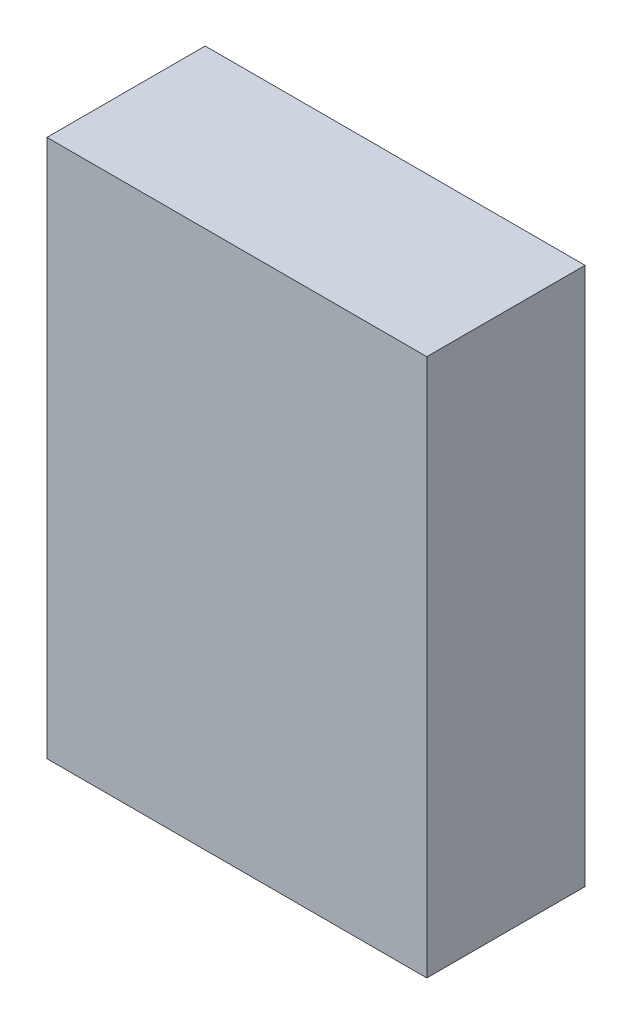
ISO-10303-21;
HEADER;
FILE_DESCRIPTION(('STEP AP214'),'2;1');
FILE_NAME('part.step','',(''),(''),'','','');
FILE_SCHEMA(('AUTOMOTIVE_DESIGN { 1 0 10303 214 1 1 1 1 }'));
ENDSEC;
DATA;
#1=APPLICATION_CONTEXT('core data for automotive mechanical design processes');
#2=APPLICATION_PROTOCOL_DEFINITION('international standard','automotive_design',2000,#1);
#3=PRODUCT_CONTEXT('',#1,'mechanical');
#4=PRODUCT('Part','Part','',(#3));
#5=PRODUCT_RELATED_PRODUCT_CATEGORY('part','',(#4));
#6=PRODUCT_DEFINITION_FORMATION('','',#4);
#7=PRODUCT_DEFINITION_CONTEXT('part definition',#1,'design');
#8=PRODUCT_DEFINITION('design','',#6,#7);
#9=PRODUCT_DEFINITION_SHAPE('','',#8);
#10=(LENGTH_UNIT() NAMED_UNIT(*) SI_UNIT(.MILLI.,.METRE.));
#11=(NAMED_UNIT(*) PLANE_ANGLE_UNIT() SI_UNIT($,.RADIAN.));
#12=(NAMED_UNIT(*) SI_UNIT($,.STERADIAN.) SOLID_ANGLE_UNIT());
#13=UNCERTAINTY_MEASURE_WITH_UNIT(LENGTH_MEASURE(1.E-05),#10,'distance_accuracy_value','');
#14=(GEOMETRIC_REPRESENTATION_CONTEXT(3) GLOBAL_UNCERTAINTY_ASSIGNED_CONTEXT((#13)) GLOBAL_UNIT_ASSIGNED_CONTEXT((#10,
#11,#12)) REPRESENTATION_CONTEXT('',''));
#15=CARTESIAN_POINT('',(0.,0.,0.));
#16=DIRECTION('',(0.,0.,1.));
#17=DIRECTION('',(1.,0.,0.));
#18=AXIS2_PLACEMENT_3D('',#15,#16,#17);
#19=CARTESIAN_POINT('',(60.,85.,50.));
#20=DIRECTION('',(-1.,0.,0.));
#21=DIRECTION('',(0.,-1.,0.));
#22=AXIS2_PLACEMENT_3D('',#19,#20,#21);
#23=PLANE('',#22);
#24=DIRECTION('',(0.,1.,0.));
#25=VECTOR('',#24,1.);
#26=CARTESIAN_POINT('',(60.,85.,0.));
#27=LINE('',#26,#25);
#28=CARTESIAN_POINT('',(60.,-85.,0.));
#29=VERTEX_POINT('',#28);
#30=CARTESIAN_POINT('',(60.,85.,0.));
#31=VERTEX_POINT('',#30);
#32=EDGE_CURVE('E96',#29,#31,#27,.T.);
#33=ORIENTED_EDGE('',*,*,#32,.T.);
#34=DIRECTION('',(0.,0.,-1.));
#35=VECTOR('',#34,1.);
#36=CARTESIAN_POINT('',(60.,85.,50.));
#37=LINE('',#36,#35);
#38=CARTESIAN_POINT('',(60.,85.,50.));
#39=VERTEX_POINT('',#38);
#40=EDGE_CURVE('E11',#39,#31,#37,.T.);
#41=ORIENTED_EDGE('',*,*,#40,.F.);
#42=DIRECTION('',(0.,1.,0.));
#43=VECTOR('',#42,1.);
#44=CARTESIAN_POINT('',(60.,85.,50.));
#45=LINE('',#44,#43);
#46=CARTESIAN_POINT('',(60.,-85.,50.));
#47=VERTEX_POINT('',#46);
#48=EDGE_CURVE('E84',#47,#39,#45,.T.);
#49=ORIENTED_EDGE('',*,*,#48,.F.);
#50=DIRECTION('',(0.,0.,-1.));
#51=VECTOR('',#50,1.);
#52=CARTESIAN_POINT('',(60.,-85.,50.));
#53=LINE('',#52,#51);
#54=EDGE_CURVE('E92',#47,#29,#53,.T.);
#55=ORIENTED_EDGE('',*,*,#54,.T.);
#56=EDGE_LOOP('',(#33,#41,#49,#55));
#57=FACE_BOUND('',#56,.T.);
#58=ADVANCED_FACE('F33',(#57),#23,.F.);
#59=CARTESIAN_POINT('',(-60.,85.,50.));
#60=DIRECTION('',(0.,-1.,0.));
#61=DIRECTION('',(0.,0.,-1.));
#62=AXIS2_PLACEMENT_3D('',#59,#60,#61);
#63=PLANE('',#62);
#64=DIRECTION('',(-1.,0.,0.));
#65=VECTOR('',#64,1.);
#66=CARTESIAN_POINT('',(-60.,85.,0.));
#67=LINE('',#66,#65);
#68=CARTESIAN_POINT('',(-60.,85.,0.));
#69=VERTEX_POINT('',#68);
#70=EDGE_CURVE('E88',#31,#69,#67,.T.);
#71=ORIENTED_EDGE('',*,*,#70,.T.);
#72=DIRECTION('',(0.,0.,-1.));
#73=VECTOR('',#72,1.);
#74=CARTESIAN_POINT('',(-60.,85.,50.));
#75=LINE('',#74,#73);
#76=CARTESIAN_POINT('',(-60.,85.,50.));
#77=VERTEX_POINT('',#76);
#78=EDGE_CURVE('E41',#77,#69,#75,.T.);
#79=ORIENTED_EDGE('',*,*,#78,.F.);
#80=DIRECTION('',(-1.,0.,0.));
#81=VECTOR('',#80,1.);
#82=CARTESIAN_POINT('',(-60.,85.,50.));
#83=LINE('',#82,#81);
#84=EDGE_CURVE('E79',#39,#77,#83,.T.);
#85=ORIENTED_EDGE('',*,*,#84,.F.);
#86=ORIENTED_EDGE('',*,*,#40,.T.);
#87=EDGE_LOOP('',(#71,#79,#85,#86));
#88=FACE_BOUND('',#87,.T.);
#89=ADVANCED_FACE('F87',(#88),#63,.F.);
#90=CARTESIAN_POINT('',(-60.,85.,50.));
#91=DIRECTION('',(1.,0.,0.));
#92=DIRECTION('',(0.,1.,0.));
#93=AXIS2_PLACEMENT_3D('',#90,#91,#92);
#94=PLANE('',#93);
#95=DIRECTION('',(0.,-1.,0.));
#96=VECTOR('',#95,1.);
#97=CARTESIAN_POINT('',(-60.,85.,0.));
#98=LINE('',#97,#96);
#99=CARTESIAN_POINT('',(-60.,-85.,0.));
#100=VERTEX_POINT('',#99);
#101=EDGE_CURVE('E66',#69,#100,#98,.T.);
#102=ORIENTED_EDGE('',*,*,#101,.T.);
#103=DIRECTION('',(0.,0.,-1.));
#104=VECTOR('',#103,1.);
#105=CARTESIAN_POINT('',(-60.,-85.,50.));
#106=LINE('',#105,#104);
#107=CARTESIAN_POINT('',(-60.,-85.,50.));
#108=VERTEX_POINT('',#107);
#109=EDGE_CURVE('E89',#108,#100,#106,.T.);
#110=ORIENTED_EDGE('',*,*,#109,.F.);
#111=DIRECTION('',(0.,-1.,0.));
#112=VECTOR('',#111,1.);
#113=CARTESIAN_POINT('',(-60.,85.,50.));
#114=LINE('',#113,#112);
#115=EDGE_CURVE('E82',#77,#108,#114,.T.);
#116=ORIENTED_EDGE('',*,*,#115,.F.);
#117=ORIENTED_EDGE('',*,*,#78,.T.);
#118=EDGE_LOOP('',(#102,#110,#116,#117));
#119=FACE_BOUND('',#118,.T.);
#120=ADVANCED_FACE('F90',(#119),#94,.F.);
#121=CARTESIAN_POINT('',(-60.,-85.,50.));
#122=DIRECTION('',(0.,1.,0.));
#123=DIRECTION('',(0.,0.,1.));
#124=AXIS2_PLACEMENT_3D('',#121,#122,#123);
#125=PLANE('',#124);
#126=DIRECTION('',(1.,0.,0.));
#127=VECTOR('',#126,1.);
#128=CARTESIAN_POINT('',(-60.,-85.,0.));
#129=LINE('',#128,#127);
#130=EDGE_CURVE('E72',#100,#29,#129,.T.);
#131=ORIENTED_EDGE('',*,*,#130,.T.);
#132=ORIENTED_EDGE('',*,*,#54,.F.);
#133=DIRECTION('',(1.,0.,0.));
#134=VECTOR('',#133,1.);
#135=CARTESIAN_POINT('',(-60.,-85.,50.));
#136=LINE('',#135,#134);
#137=EDGE_CURVE('E49',#108,#47,#136,.T.);
#138=ORIENTED_EDGE('',*,*,#137,.F.);
#139=ORIENTED_EDGE('',*,*,#109,.T.);
#140=EDGE_LOOP('',(#131,#132,#138,#139));
#141=FACE_BOUND('',#140,.T.);
#142=ADVANCED_FACE('F103',(#141),#125,.F.);
#143=CARTESIAN_POINT('',(0.,0.,50.));
#144=DIRECTION('',(0.,0.,1.));
#145=DIRECTION('',(1.,0.,0.));
#146=AXIS2_PLACEMENT_3D('',#143,#144,#145);
#147=PLANE('',#146);
#148=ORIENTED_EDGE('',*,*,#48,.T.);
#149=ORIENTED_EDGE('',*,*,#84,.T.);
#150=ORIENTED_EDGE('',*,*,#115,.T.);
#151=ORIENTED_EDGE('',*,*,#137,.T.);
#152=EDGE_LOOP('',(#148,#149,#150,#151));
#153=FACE_BOUND('',#152,.T.);
#154=ADVANCED_FACE('F80',(#153),#147,.T.);
#155=CARTESIAN_POINT('',(0.,0.,0.));
#156=DIRECTION('',(0.,0.,1.));
#157=DIRECTION('',(1.,0.,0.));
#158=AXIS2_PLACEMENT_3D('',#155,#156,#157);
#159=PLANE('',#158);
#160=ORIENTED_EDGE('',*,*,#32,.F.);
#161=ORIENTED_EDGE('',*,*,#130,.F.);
#162=ORIENTED_EDGE('',*,*,#101,.F.);
#163=ORIENTED_EDGE('',*,*,#70,.F.);
#164=EDGE_LOOP('',(#160,#161,#162,#163));
#165=FACE_BOUND('',#164,.T.);
#166=ADVANCED_FACE('F106',(#165),#159,.F.);
#167=CLOSED_SHELL('',(#58,#89,#120,#142,#154,#166));
#168=MANIFOLD_SOLID_BREP('B2',#167);
#169=ADVANCED_BREP_SHAPE_REPRESENTATION('',(#18,#168),#14);
#170=SHAPE_DEFINITION_REPRESENTATION(#9,#169);
ENDSEC;
END-ISO-10303-21;
